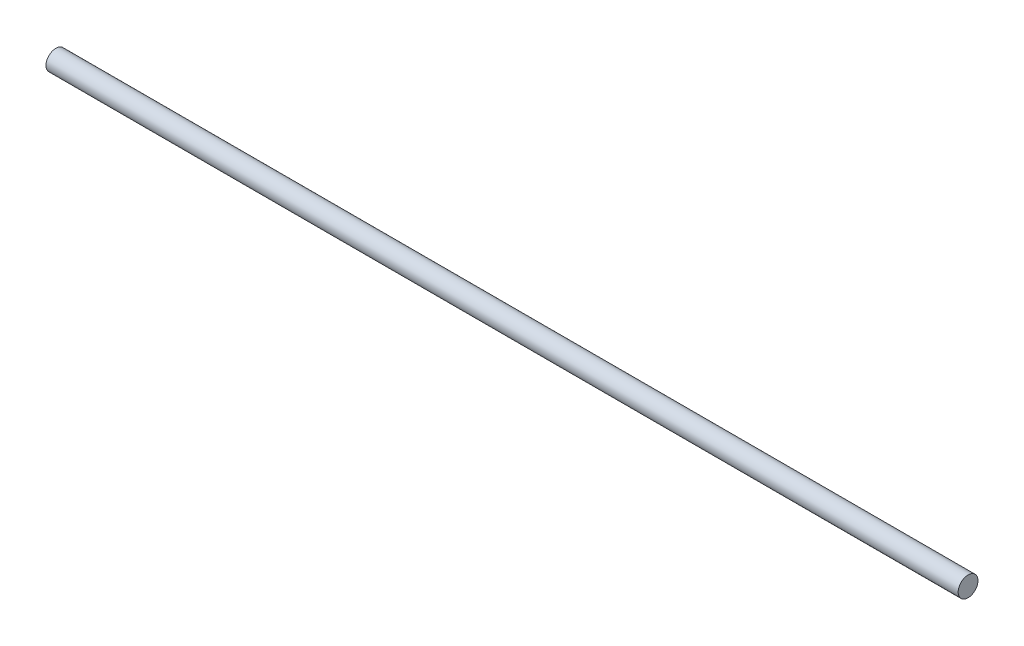
ISO-10303-21;
HEADER;
FILE_DESCRIPTION(('STEP AP214'),'2;1');
FILE_NAME('part.step','',(''),(''),'','','');
FILE_SCHEMA(('AUTOMOTIVE_DESIGN { 1 0 10303 214 1 1 1 1 }'));
ENDSEC;
DATA;
#1=APPLICATION_CONTEXT('core data for automotive mechanical design processes');
#2=APPLICATION_PROTOCOL_DEFINITION('international standard','automotive_design',2000,#1);
#3=PRODUCT_CONTEXT('',#1,'mechanical');
#4=PRODUCT('Part','Part','',(#3));
#5=PRODUCT_RELATED_PRODUCT_CATEGORY('part','',(#4));
#6=PRODUCT_DEFINITION_FORMATION('','',#4);
#7=PRODUCT_DEFINITION_CONTEXT('part definition',#1,'design');
#8=PRODUCT_DEFINITION('design','',#6,#7);
#9=PRODUCT_DEFINITION_SHAPE('','',#8);
#10=(LENGTH_UNIT() NAMED_UNIT(*) SI_UNIT(.MILLI.,.METRE.));
#11=(NAMED_UNIT(*) PLANE_ANGLE_UNIT() SI_UNIT($,.RADIAN.));
#12=(NAMED_UNIT(*) SI_UNIT($,.STERADIAN.) SOLID_ANGLE_UNIT());
#13=UNCERTAINTY_MEASURE_WITH_UNIT(LENGTH_MEASURE(1.E-05),#10,'distance_accuracy_value','');
#14=(GEOMETRIC_REPRESENTATION_CONTEXT(3) GLOBAL_UNCERTAINTY_ASSIGNED_CONTEXT((#13)) GLOBAL_UNIT_ASSIGNED_CONTEXT((#10,
#11,#12)) REPRESENTATION_CONTEXT('',''));
#15=CARTESIAN_POINT('',(0.,0.,0.));
#16=DIRECTION('',(0.,0.,1.));
#17=DIRECTION('',(1.,0.,0.));
#18=AXIS2_PLACEMENT_3D('',#15,#16,#17);
#19=CARTESIAN_POINT('',(115.,0.,0.));
#20=DIRECTION('',(-1.,0.,0.));
#21=DIRECTION('',(0.,0.,1.));
#22=AXIS2_PLACEMENT_3D('',#19,#20,#21);
#23=CYLINDRICAL_SURFACE('',#22,1.25);
#24=CARTESIAN_POINT('',(115.,0.,0.));
#25=DIRECTION('',(1.,0.,0.));
#26=DIRECTION('',(0.,0.,-1.));
#27=AXIS2_PLACEMENT_3D('',#24,#25,#26);
#28=CIRCLE('',#27,1.25);
#29=CARTESIAN_POINT('',(115.,0.,-1.25));
#30=VERTEX_POINT('',#29);
#31=EDGE_CURVE('E10',#30,#30,#28,.T.);
#32=ORIENTED_EDGE('',*,*,#31,.F.);
#33=EDGE_LOOP('',(#32));
#34=FACE_BOUND('',#33,.T.);
#35=CARTESIAN_POINT('',(0.,0.,0.));
#36=DIRECTION('',(1.,0.,0.));
#37=DIRECTION('',(0.,0.,-1.));
#38=AXIS2_PLACEMENT_3D('',#35,#36,#37);
#39=CIRCLE('',#38,1.25);
#40=CARTESIAN_POINT('',(0.,0.,-1.25));
#41=VERTEX_POINT('',#40);
#42=EDGE_CURVE('E40',#41,#41,#39,.T.);
#43=ORIENTED_EDGE('',*,*,#42,.T.);
#44=EDGE_LOOP('',(#43));
#45=FACE_BOUND('',#44,.T.);
#46=ADVANCED_FACE('F37',(#34,#45),#23,.T.);
#47=CARTESIAN_POINT('',(115.,0.,0.));
#48=DIRECTION('',(1.,0.,0.));
#49=DIRECTION('',(0.,0.,-1.));
#50=AXIS2_PLACEMENT_3D('',#47,#48,#49);
#51=PLANE('',#50);
#52=ORIENTED_EDGE('',*,*,#31,.T.);
#53=EDGE_LOOP('',(#52));
#54=FACE_BOUND('',#53,.T.);
#55=ADVANCED_FACE('F54',(#54),#51,.T.);
#56=CARTESIAN_POINT('',(0.,0.,0.));
#57=DIRECTION('',(1.,0.,0.));
#58=DIRECTION('',(0.,0.,-1.));
#59=AXIS2_PLACEMENT_3D('',#56,#57,#58);
#60=PLANE('',#59);
#61=ORIENTED_EDGE('',*,*,#42,.F.);
#62=EDGE_LOOP('',(#61));
#63=FACE_BOUND('',#62,.T.);
#64=ADVANCED_FACE('F52',(#63),#60,.F.);
#65=CLOSED_SHELL('',(#46,#55,#64));
#66=MANIFOLD_SOLID_BREP('B2',#65);
#67=ADVANCED_BREP_SHAPE_REPRESENTATION('',(#18,#66),#14);
#68=SHAPE_DEFINITION_REPRESENTATION(#9,#67);
ENDSEC;
END-ISO-10303-21;
